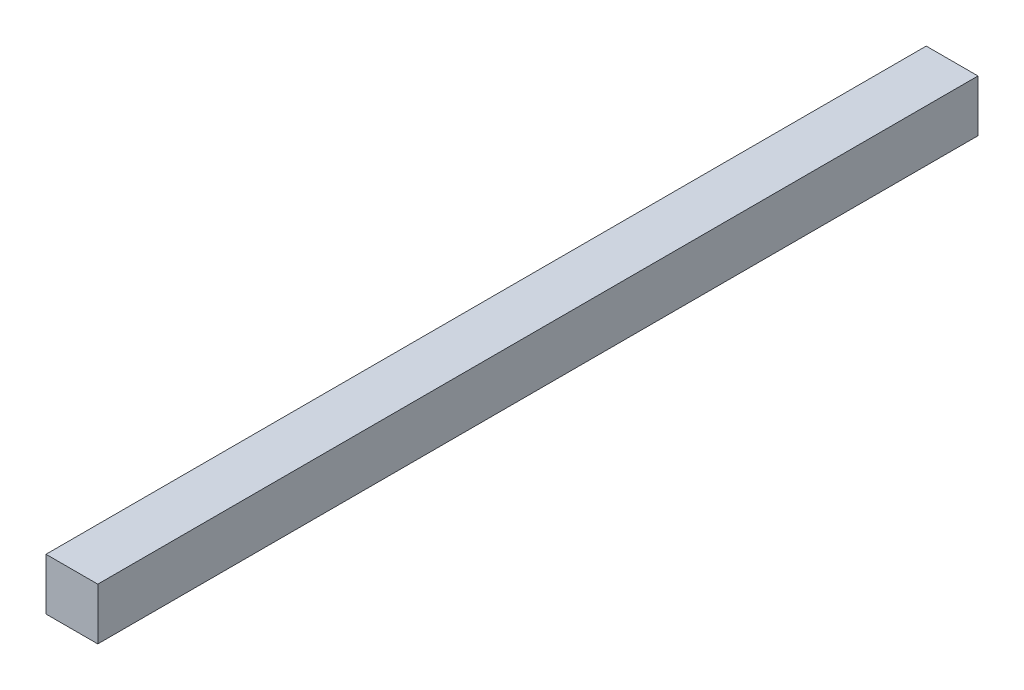
ISO-10303-21;
HEADER;
FILE_DESCRIPTION(('STEP AP214'),'2;1');
FILE_NAME('part.step','',(''),(''),'','','');
FILE_SCHEMA(('AUTOMOTIVE_DESIGN { 1 0 10303 214 1 1 1 1 }'));
ENDSEC;
DATA;
#1=APPLICATION_CONTEXT('core data for automotive mechanical design processes');
#2=APPLICATION_PROTOCOL_DEFINITION('international standard','automotive_design',2000,#1);
#3=PRODUCT_CONTEXT('',#1,'mechanical');
#4=PRODUCT('Part','Part','',(#3));
#5=PRODUCT_RELATED_PRODUCT_CATEGORY('part','',(#4));
#6=PRODUCT_DEFINITION_FORMATION('','',#4);
#7=PRODUCT_DEFINITION_CONTEXT('part definition',#1,'design');
#8=PRODUCT_DEFINITION('design','',#6,#7);
#9=PRODUCT_DEFINITION_SHAPE('','',#8);
#10=(LENGTH_UNIT() NAMED_UNIT(*) SI_UNIT(.MILLI.,.METRE.));
#11=(NAMED_UNIT(*) PLANE_ANGLE_UNIT() SI_UNIT($,.RADIAN.));
#12=(NAMED_UNIT(*) SI_UNIT($,.STERADIAN.) SOLID_ANGLE_UNIT());
#13=UNCERTAINTY_MEASURE_WITH_UNIT(LENGTH_MEASURE(1.E-05),#10,'distance_accuracy_value','');
#14=(GEOMETRIC_REPRESENTATION_CONTEXT(3) GLOBAL_UNCERTAINTY_ASSIGNED_CONTEXT((#13)) GLOBAL_UNIT_ASSIGNED_CONTEXT((#10,
#11,#12)) REPRESENTATION_CONTEXT('',''));
#15=CARTESIAN_POINT('',(0.,0.,0.));
#16=DIRECTION('',(0.,0.,1.));
#17=DIRECTION('',(1.,0.,0.));
#18=AXIS2_PLACEMENT_3D('',#15,#16,#17);
#19=CARTESIAN_POINT('',(-10.,10.,340.));
#20=DIRECTION('',(1.,0.,0.));
#21=DIRECTION('',(0.,0.,-1.));
#22=AXIS2_PLACEMENT_3D('',#19,#20,#21);
#23=PLANE('',#22);
#24=DIRECTION('',(0.,-1.,0.));
#25=VECTOR('',#24,1.);
#26=CARTESIAN_POINT('',(-10.,10.,0.));
#27=LINE('',#26,#25);
#28=CARTESIAN_POINT('',(-10.,10.,0.));
#29=VERTEX_POINT('',#28);
#30=CARTESIAN_POINT('',(-10.,-10.,0.));
#31=VERTEX_POINT('',#30);
#32=EDGE_CURVE('E95',#29,#31,#27,.T.);
#33=ORIENTED_EDGE('',*,*,#32,.T.);
#34=DIRECTION('',(0.,0.,-1.));
#35=VECTOR('',#34,1.);
#36=CARTESIAN_POINT('',(-10.,-10.,340.));
#37=LINE('',#36,#35);
#38=CARTESIAN_POINT('',(-10.,-10.,340.));
#39=VERTEX_POINT('',#38);
#40=EDGE_CURVE('E11',#39,#31,#37,.T.);
#41=ORIENTED_EDGE('',*,*,#40,.F.);
#42=DIRECTION('',(0.,-1.,0.));
#43=VECTOR('',#42,1.);
#44=CARTESIAN_POINT('',(-10.,10.,340.));
#45=LINE('',#44,#43);
#46=CARTESIAN_POINT('',(-10.,10.,340.));
#47=VERTEX_POINT('',#46);
#48=EDGE_CURVE('E83',#47,#39,#45,.T.);
#49=ORIENTED_EDGE('',*,*,#48,.F.);
#50=DIRECTION('',(0.,0.,-1.));
#51=VECTOR('',#50,1.);
#52=CARTESIAN_POINT('',(-10.,10.,340.));
#53=LINE('',#52,#51);
#54=EDGE_CURVE('E91',#47,#29,#53,.T.);
#55=ORIENTED_EDGE('',*,*,#54,.T.);
#56=EDGE_LOOP('',(#33,#41,#49,#55));
#57=FACE_BOUND('',#56,.T.);
#58=ADVANCED_FACE('F32',(#57),#23,.F.);
#59=CARTESIAN_POINT('',(-10.,-10.,340.));
#60=DIRECTION('',(0.,1.,0.));
#61=DIRECTION('',(0.,0.,1.));
#62=AXIS2_PLACEMENT_3D('',#59,#60,#61);
#63=PLANE('',#62);
#64=DIRECTION('',(1.,0.,0.));
#65=VECTOR('',#64,1.);
#66=CARTESIAN_POINT('',(-10.,-10.,0.));
#67=LINE('',#66,#65);
#68=CARTESIAN_POINT('',(10.,-10.,0.));
#69=VERTEX_POINT('',#68);
#70=EDGE_CURVE('E87',#31,#69,#67,.T.);
#71=ORIENTED_EDGE('',*,*,#70,.T.);
#72=DIRECTION('',(0.,0.,-1.));
#73=VECTOR('',#72,1.);
#74=CARTESIAN_POINT('',(10.,-10.,340.));
#75=LINE('',#74,#73);
#76=CARTESIAN_POINT('',(10.,-10.,340.));
#77=VERTEX_POINT('',#76);
#78=EDGE_CURVE('E40',#77,#69,#75,.T.);
#79=ORIENTED_EDGE('',*,*,#78,.F.);
#80=DIRECTION('',(1.,0.,0.));
#81=VECTOR('',#80,1.);
#82=CARTESIAN_POINT('',(-10.,-10.,340.));
#83=LINE('',#82,#81);
#84=EDGE_CURVE('E78',#39,#77,#83,.T.);
#85=ORIENTED_EDGE('',*,*,#84,.F.);
#86=ORIENTED_EDGE('',*,*,#40,.T.);
#87=EDGE_LOOP('',(#71,#79,#85,#86));
#88=FACE_BOUND('',#87,.T.);
#89=ADVANCED_FACE('F86',(#88),#63,.F.);
#90=CARTESIAN_POINT('',(10.,10.,340.));
#91=DIRECTION('',(-1.,0.,0.));
#92=DIRECTION('',(0.,-1.,0.));
#93=AXIS2_PLACEMENT_3D('',#90,#91,#92);
#94=PLANE('',#93);
#95=DIRECTION('',(0.,1.,0.));
#96=VECTOR('',#95,1.);
#97=CARTESIAN_POINT('',(10.,10.,0.));
#98=LINE('',#97,#96);
#99=CARTESIAN_POINT('',(10.,10.,0.));
#100=VERTEX_POINT('',#99);
#101=EDGE_CURVE('E65',#69,#100,#98,.T.);
#102=ORIENTED_EDGE('',*,*,#101,.T.);
#103=DIRECTION('',(0.,0.,-1.));
#104=VECTOR('',#103,1.);
#105=CARTESIAN_POINT('',(10.,10.,340.));
#106=LINE('',#105,#104);
#107=CARTESIAN_POINT('',(10.,10.,340.));
#108=VERTEX_POINT('',#107);
#109=EDGE_CURVE('E88',#108,#100,#106,.T.);
#110=ORIENTED_EDGE('',*,*,#109,.F.);
#111=DIRECTION('',(0.,1.,0.));
#112=VECTOR('',#111,1.);
#113=CARTESIAN_POINT('',(10.,10.,340.));
#114=LINE('',#113,#112);
#115=EDGE_CURVE('E81',#77,#108,#114,.T.);
#116=ORIENTED_EDGE('',*,*,#115,.F.);
#117=ORIENTED_EDGE('',*,*,#78,.T.);
#118=EDGE_LOOP('',(#102,#110,#116,#117));
#119=FACE_BOUND('',#118,.T.);
#120=ADVANCED_FACE('F89',(#119),#94,.F.);
#121=CARTESIAN_POINT('',(-10.,10.,340.));
#122=DIRECTION('',(0.,-1.,0.));
#123=DIRECTION('',(0.,0.,-1.));
#124=AXIS2_PLACEMENT_3D('',#121,#122,#123);
#125=PLANE('',#124);
#126=DIRECTION('',(-1.,0.,0.));
#127=VECTOR('',#126,1.);
#128=CARTESIAN_POINT('',(-10.,10.,0.));
#129=LINE('',#128,#127);
#130=EDGE_CURVE('E71',#100,#29,#129,.T.);
#131=ORIENTED_EDGE('',*,*,#130,.T.);
#132=ORIENTED_EDGE('',*,*,#54,.F.);
#133=DIRECTION('',(-1.,0.,0.));
#134=VECTOR('',#133,1.);
#135=CARTESIAN_POINT('',(-10.,10.,340.));
#136=LINE('',#135,#134);
#137=EDGE_CURVE('E48',#108,#47,#136,.T.);
#138=ORIENTED_EDGE('',*,*,#137,.F.);
#139=ORIENTED_EDGE('',*,*,#109,.T.);
#140=EDGE_LOOP('',(#131,#132,#138,#139));
#141=FACE_BOUND('',#140,.T.);
#142=ADVANCED_FACE('F102',(#141),#125,.F.);
#143=CARTESIAN_POINT('',(0.,0.,340.));
#144=DIRECTION('',(0.,0.,1.));
#145=DIRECTION('',(1.,0.,0.));
#146=AXIS2_PLACEMENT_3D('',#143,#144,#145);
#147=PLANE('',#146);
#148=ORIENTED_EDGE('',*,*,#48,.T.);
#149=ORIENTED_EDGE('',*,*,#84,.T.);
#150=ORIENTED_EDGE('',*,*,#115,.T.);
#151=ORIENTED_EDGE('',*,*,#137,.T.);
#152=EDGE_LOOP('',(#148,#149,#150,#151));
#153=FACE_BOUND('',#152,.T.);
#154=ADVANCED_FACE('F79',(#153),#147,.T.);
#155=CARTESIAN_POINT('',(0.,0.,0.));
#156=DIRECTION('',(0.,0.,1.));
#157=DIRECTION('',(1.,0.,0.));
#158=AXIS2_PLACEMENT_3D('',#155,#156,#157);
#159=PLANE('',#158);
#160=ORIENTED_EDGE('',*,*,#32,.F.);
#161=ORIENTED_EDGE('',*,*,#130,.F.);
#162=ORIENTED_EDGE('',*,*,#101,.F.);
#163=ORIENTED_EDGE('',*,*,#70,.F.);
#164=EDGE_LOOP('',(#160,#161,#162,#163));
#165=FACE_BOUND('',#164,.T.);
#166=ADVANCED_FACE('F105',(#165),#159,.F.);
#167=CLOSED_SHELL('',(#58,#89,#120,#142,#154,#166));
#168=MANIFOLD_SOLID_BREP('B2',#167);
#169=ADVANCED_BREP_SHAPE_REPRESENTATION('',(#18,#168),#14);
#170=SHAPE_DEFINITION_REPRESENTATION(#9,#169);
ENDSEC;
END-ISO-10303-21;
